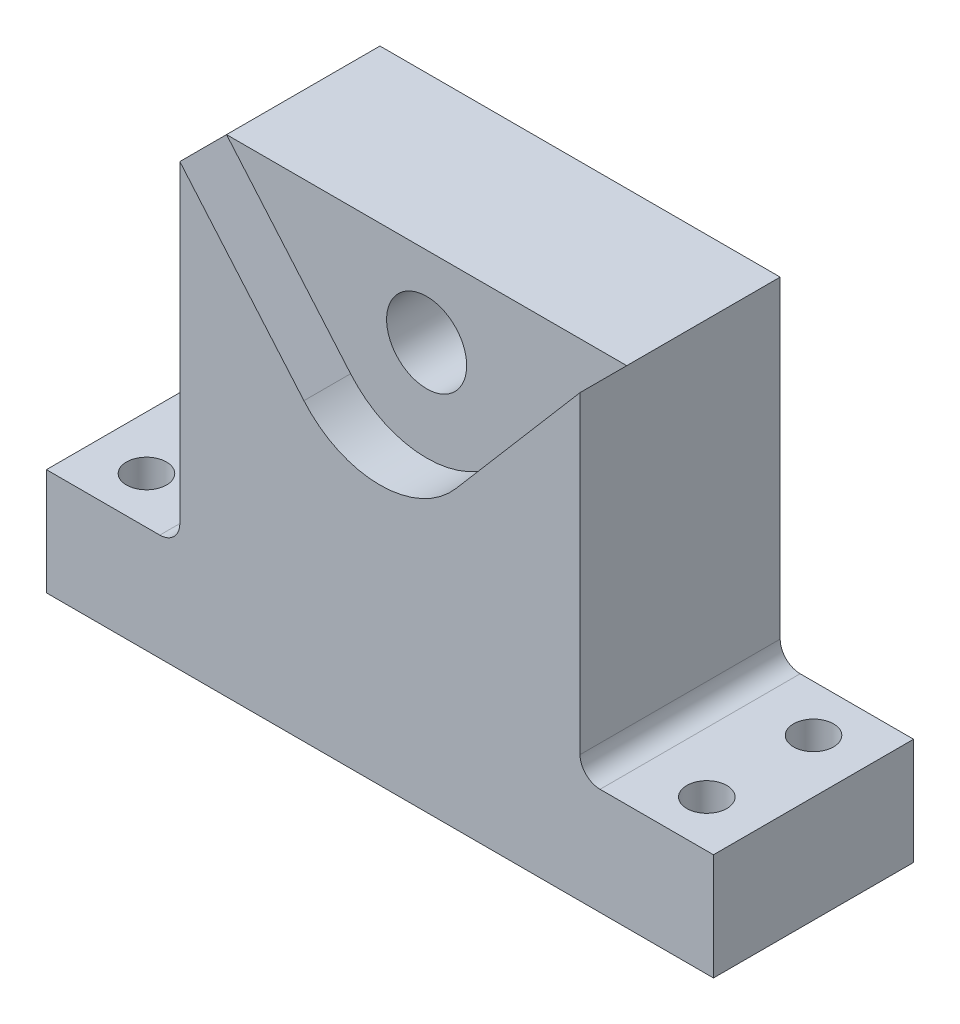
ISO-10303-21;
HEADER;
FILE_DESCRIPTION(('STEP AP214'),'2;1');
FILE_NAME('part.step','',(''),(''),'','','');
FILE_SCHEMA(('AUTOMOTIVE_DESIGN { 1 0 10303 214 1 1 1 1 }'));
ENDSEC;
DATA;
#1=APPLICATION_CONTEXT('core data for automotive mechanical design processes');
#2=APPLICATION_PROTOCOL_DEFINITION('international standard','automotive_design',2000,#1);
#3=PRODUCT_CONTEXT('',#1,'mechanical');
#4=PRODUCT('Part','Part','',(#3));
#5=PRODUCT_RELATED_PRODUCT_CATEGORY('part','',(#4));
#6=PRODUCT_DEFINITION_FORMATION('','',#4);
#7=PRODUCT_DEFINITION_CONTEXT('part definition',#1,'design');
#8=PRODUCT_DEFINITION('design','',#6,#7);
#9=PRODUCT_DEFINITION_SHAPE('','',#8);
#10=(LENGTH_UNIT() NAMED_UNIT(*) SI_UNIT(.MILLI.,.METRE.));
#11=(NAMED_UNIT(*) PLANE_ANGLE_UNIT() SI_UNIT($,.RADIAN.));
#12=(NAMED_UNIT(*) SI_UNIT($,.STERADIAN.) SOLID_ANGLE_UNIT());
#13=UNCERTAINTY_MEASURE_WITH_UNIT(LENGTH_MEASURE(1.E-05),#10,'distance_accuracy_value','');
#14=(GEOMETRIC_REPRESENTATION_CONTEXT(3) GLOBAL_UNCERTAINTY_ASSIGNED_CONTEXT((#13)) GLOBAL_UNIT_ASSIGNED_CONTEXT((#10,
#11,#12)) REPRESENTATION_CONTEXT('',''));
#15=CARTESIAN_POINT('',(0.,0.,0.));
#16=DIRECTION('',(0.,0.,1.));
#17=DIRECTION('',(1.,0.,0.));
#18=AXIS2_PLACEMENT_3D('',#15,#16,#17);
#19=CARTESIAN_POINT('',(-15.,33.,15.));
#20=DIRECTION('',(0.,-1.,0.));
#21=DIRECTION('',(0.,0.,-1.));
#22=AXIS2_PLACEMENT_3D('',#19,#20,#21);
#23=PLANE('',#22);
#24=DIRECTION('',(-1.,0.,0.));
#25=VECTOR('',#24,1.);
#26=CARTESIAN_POINT('',(0.,33.,11.5));
#27=LINE('',#26,#25);
#28=CARTESIAN_POINT('',(15.,33.,11.5));
#29=VERTEX_POINT('',#28);
#30=CARTESIAN_POINT('',(-15.,33.,11.5));
#31=VERTEX_POINT('',#30);
#32=EDGE_CURVE('E143',#29,#31,#27,.T.);
#33=ORIENTED_EDGE('',*,*,#32,.F.);
#34=DIRECTION('',(0.,0.,-1.));
#35=VECTOR('',#34,1.);
#36=CARTESIAN_POINT('',(15.,33.,15.));
#37=LINE('',#36,#35);
#38=CARTESIAN_POINT('',(15.,33.,0.));
#39=VERTEX_POINT('',#38);
#40=EDGE_CURVE('E276',#29,#39,#37,.T.);
#41=ORIENTED_EDGE('',*,*,#40,.T.);
#42=DIRECTION('',(-1.,0.,0.));
#43=VECTOR('',#42,1.);
#44=CARTESIAN_POINT('',(-15.,33.,0.));
#45=LINE('',#44,#43);
#46=CARTESIAN_POINT('',(-15.,33.,0.));
#47=VERTEX_POINT('',#46);
#48=EDGE_CURVE('E258',#39,#47,#45,.T.);
#49=ORIENTED_EDGE('',*,*,#48,.T.);
#50=DIRECTION('',(0.,0.,-1.));
#51=VECTOR('',#50,1.);
#52=CARTESIAN_POINT('',(-15.,33.,15.));
#53=LINE('',#52,#51);
#54=EDGE_CURVE('E271',#31,#47,#53,.T.);
#55=ORIENTED_EDGE('',*,*,#54,.F.);
#56=EDGE_LOOP('',(#33,#41,#49,#55));
#57=FACE_BOUND('',#56,.T.);
#58=ADVANCED_FACE('F38',(#57),#23,.F.);
#59=CARTESIAN_POINT('',(0.,27.,0.));
#60=DIRECTION('',(0.,0.,1.));
#61=DIRECTION('',(1.,0.,0.));
#62=AXIS2_PLACEMENT_3D('',#59,#60,#61);
#63=CYLINDRICAL_SURFACE('',#62,3.);
#64=CARTESIAN_POINT('',(0.,27.,0.));
#65=DIRECTION('',(0.,0.,1.));
#66=DIRECTION('',(1.,0.,0.));
#67=AXIS2_PLACEMENT_3D('',#64,#65,#66);
#68=CIRCLE('',#67,3.);
#69=CARTESIAN_POINT('',(3.,27.,0.));
#70=VERTEX_POINT('',#69);
#71=EDGE_CURVE('E208',#70,#70,#68,.T.);
#72=ORIENTED_EDGE('',*,*,#71,.F.);
#73=EDGE_LOOP('',(#72));
#74=FACE_BOUND('',#73,.T.);
#75=CARTESIAN_POINT('',(0.,27.,11.5));
#76=DIRECTION('',(0.,0.,1.));
#77=DIRECTION('',(1.,0.,0.));
#78=AXIS2_PLACEMENT_3D('',#75,#76,#77);
#79=CIRCLE('',#78,3.);
#80=CARTESIAN_POINT('',(3.,27.,11.5));
#81=VERTEX_POINT('',#80);
#82=EDGE_CURVE('E158',#81,#81,#79,.F.);
#83=ORIENTED_EDGE('',*,*,#82,.F.);
#84=EDGE_LOOP('',(#83));
#85=FACE_BOUND('',#84,.T.);
#86=ADVANCED_FACE('F369',(#74,#85),#63,.F.);
#87=CARTESIAN_POINT('',(-25.,0.,15.));
#88=DIRECTION('',(1.,0.,0.));
#89=DIRECTION('',(0.,0.,-1.));
#90=AXIS2_PLACEMENT_3D('',#87,#88,#89);
#91=PLANE('',#90);
#92=DIRECTION('',(0.,-1.,0.));
#93=VECTOR('',#92,1.);
#94=CARTESIAN_POINT('',(-25.,0.,0.));
#95=LINE('',#94,#93);
#96=CARTESIAN_POINT('',(-25.,7.99999999999999,0.));
#97=VERTEX_POINT('',#96);
#98=CARTESIAN_POINT('',(-25.,0.,0.));
#99=VERTEX_POINT('',#98);
#100=EDGE_CURVE('E215',#97,#99,#95,.T.);
#101=ORIENTED_EDGE('',*,*,#100,.T.);
#102=DIRECTION('',(0.,0.,-1.));
#103=VECTOR('',#102,1.);
#104=CARTESIAN_POINT('',(-25.,0.,15.));
#105=LINE('',#104,#103);
#106=CARTESIAN_POINT('',(-25.,0.,15.));
#107=VERTEX_POINT('',#106);
#108=EDGE_CURVE('E288',#107,#99,#105,.T.);
#109=ORIENTED_EDGE('',*,*,#108,.F.);
#110=DIRECTION('',(0.,-1.,0.));
#111=VECTOR('',#110,1.);
#112=CARTESIAN_POINT('',(-25.,0.,15.));
#113=LINE('',#112,#111);
#114=CARTESIAN_POINT('',(-25.,7.99999999999999,15.));
#115=VERTEX_POINT('',#114);
#116=EDGE_CURVE('E216',#115,#107,#113,.T.);
#117=ORIENTED_EDGE('',*,*,#116,.F.);
#118=DIRECTION('',(0.,0.,-1.));
#119=VECTOR('',#118,1.);
#120=CARTESIAN_POINT('',(-25.,7.99999999999999,15.));
#121=LINE('',#120,#119);
#122=EDGE_CURVE('E241',#115,#97,#121,.T.);
#123=ORIENTED_EDGE('',*,*,#122,.T.);
#124=EDGE_LOOP('',(#101,#109,#117,#123));
#125=FACE_BOUND('',#124,.T.);
#126=ADVANCED_FACE('F350',(#125),#91,.F.);
#127=CARTESIAN_POINT('',(25.,0.,15.));
#128=DIRECTION('',(0.,1.,0.));
#129=DIRECTION('',(0.,0.,1.));
#130=AXIS2_PLACEMENT_3D('',#127,#128,#129);
#131=PLANE('',#130);
#132=CARTESIAN_POINT('',(-21.,0.,3.5));
#133=DIRECTION('',(0.,1.,0.));
#134=DIRECTION('',(1.,0.,0.));
#135=AXIS2_PLACEMENT_3D('',#132,#133,#134);
#136=CIRCLE('',#135,1.5);
#137=CARTESIAN_POINT('',(-19.5,0.,3.5));
#138=VERTEX_POINT('',#137);
#139=EDGE_CURVE('E197',#138,#138,#136,.T.);
#140=ORIENTED_EDGE('',*,*,#139,.T.);
#141=EDGE_LOOP('',(#140));
#142=FACE_BOUND('',#141,.T.);
#143=CARTESIAN_POINT('',(-21.,0.,11.5));
#144=DIRECTION('',(0.,1.,0.));
#145=DIRECTION('',(-1.,0.,0.));
#146=AXIS2_PLACEMENT_3D('',#143,#144,#145);
#147=CIRCLE('',#146,1.5);
#148=CARTESIAN_POINT('',(-22.5,0.,11.5));
#149=VERTEX_POINT('',#148);
#150=EDGE_CURVE('E189',#149,#149,#147,.T.);
#151=ORIENTED_EDGE('',*,*,#150,.T.);
#152=EDGE_LOOP('',(#151));
#153=FACE_BOUND('',#152,.T.);
#154=CARTESIAN_POINT('',(21.,0.,11.5));
#155=DIRECTION('',(0.,1.,0.));
#156=DIRECTION('',(1.,0.,0.));
#157=AXIS2_PLACEMENT_3D('',#154,#155,#156);
#158=CIRCLE('',#157,1.5);
#159=CARTESIAN_POINT('',(22.5,0.,11.5));
#160=VERTEX_POINT('',#159);
#161=EDGE_CURVE('E180',#160,#160,#158,.T.);
#162=ORIENTED_EDGE('',*,*,#161,.T.);
#163=EDGE_LOOP('',(#162));
#164=FACE_BOUND('',#163,.T.);
#165=CARTESIAN_POINT('',(21.,0.,3.5));
#166=DIRECTION('',(0.,1.,0.));
#167=DIRECTION('',(-1.,0.,0.));
#168=AXIS2_PLACEMENT_3D('',#165,#166,#167);
#169=CIRCLE('',#168,1.5);
#170=CARTESIAN_POINT('',(19.5,0.,3.5));
#171=VERTEX_POINT('',#170);
#172=EDGE_CURVE('E204',#171,#171,#169,.T.);
#173=ORIENTED_EDGE('',*,*,#172,.T.);
#174=EDGE_LOOP('',(#173));
#175=FACE_BOUND('',#174,.T.);
#176=DIRECTION('',(1.,0.,0.));
#177=VECTOR('',#176,1.);
#178=CARTESIAN_POINT('',(25.,0.,0.));
#179=LINE('',#178,#177);
#180=CARTESIAN_POINT('',(25.,0.,0.));
#181=VERTEX_POINT('',#180);
#182=EDGE_CURVE('E245',#99,#181,#179,.T.);
#183=ORIENTED_EDGE('',*,*,#182,.T.);
#184=DIRECTION('',(0.,0.,-1.));
#185=VECTOR('',#184,1.);
#186=CARTESIAN_POINT('',(25.,0.,15.));
#187=LINE('',#186,#185);
#188=CARTESIAN_POINT('',(25.,0.,15.));
#189=VERTEX_POINT('',#188);
#190=EDGE_CURVE('E284',#189,#181,#187,.T.);
#191=ORIENTED_EDGE('',*,*,#190,.F.);
#192=DIRECTION('',(1.,0.,0.));
#193=VECTOR('',#192,1.);
#194=CARTESIAN_POINT('',(25.,0.,15.));
#195=LINE('',#194,#193);
#196=EDGE_CURVE('E220',#107,#189,#195,.T.);
#197=ORIENTED_EDGE('',*,*,#196,.F.);
#198=ORIENTED_EDGE('',*,*,#108,.T.);
#199=EDGE_LOOP('',(#183,#191,#197,#198));
#200=FACE_BOUND('',#199,.T.);
#201=ADVANCED_FACE('F355',(#142,#153,#164,#175,#200),#131,.F.);
#202=CARTESIAN_POINT('',(25.,0.,15.));
#203=DIRECTION('',(-1.,0.,0.));
#204=DIRECTION('',(0.,0.,1.));
#205=AXIS2_PLACEMENT_3D('',#202,#203,#204);
#206=PLANE('',#205);
#207=DIRECTION('',(0.,1.,0.));
#208=VECTOR('',#207,1.);
#209=CARTESIAN_POINT('',(25.,0.,0.));
#210=LINE('',#209,#208);
#211=CARTESIAN_POINT('',(25.,7.99999999999999,0.));
#212=VERTEX_POINT('',#211);
#213=EDGE_CURVE('E248',#181,#212,#210,.T.);
#214=ORIENTED_EDGE('',*,*,#213,.T.);
#215=DIRECTION('',(0.,0.,-1.));
#216=VECTOR('',#215,1.);
#217=CARTESIAN_POINT('',(25.,7.99999999999999,15.));
#218=LINE('',#217,#216);
#219=CARTESIAN_POINT('',(25.,7.99999999999999,15.));
#220=VERTEX_POINT('',#219);
#221=EDGE_CURVE('E280',#220,#212,#218,.T.);
#222=ORIENTED_EDGE('',*,*,#221,.F.);
#223=DIRECTION('',(0.,1.,0.));
#224=VECTOR('',#223,1.);
#225=CARTESIAN_POINT('',(25.,0.,15.));
#226=LINE('',#225,#224);
#227=EDGE_CURVE('E224',#189,#220,#226,.T.);
#228=ORIENTED_EDGE('',*,*,#227,.F.);
#229=ORIENTED_EDGE('',*,*,#190,.T.);
#230=EDGE_LOOP('',(#214,#222,#228,#229));
#231=FACE_BOUND('',#230,.T.);
#232=ADVANCED_FACE('F357',(#231),#206,.F.);
#233=CARTESIAN_POINT('',(25.,7.99999999999999,15.));
#234=DIRECTION('',(0.,-1.,0.));
#235=DIRECTION('',(0.,0.,-1.));
#236=AXIS2_PLACEMENT_3D('',#233,#234,#235);
#237=PLANE('',#236);
#238=CARTESIAN_POINT('',(21.,7.99999999999998,11.5));
#239=DIRECTION('',(0.,1.,0.));
#240=DIRECTION('',(1.,0.,0.));
#241=AXIS2_PLACEMENT_3D('',#238,#239,#240);
#242=CIRCLE('',#241,1.5);
#243=CARTESIAN_POINT('',(22.5,7.99999999999998,11.5));
#244=VERTEX_POINT('',#243);
#245=EDGE_CURVE('E185',#244,#244,#242,.T.);
#246=ORIENTED_EDGE('',*,*,#245,.F.);
#247=EDGE_LOOP('',(#246));
#248=FACE_BOUND('',#247,.T.);
#249=CARTESIAN_POINT('',(21.,7.99999999999998,3.5));
#250=DIRECTION('',(0.,1.,0.));
#251=DIRECTION('',(-1.,0.,0.));
#252=AXIS2_PLACEMENT_3D('',#249,#250,#251);
#253=CIRCLE('',#252,1.5);
#254=CARTESIAN_POINT('',(19.5,7.99999999999998,3.5));
#255=VERTEX_POINT('',#254);
#256=EDGE_CURVE('E184',#255,#255,#253,.T.);
#257=ORIENTED_EDGE('',*,*,#256,.F.);
#258=EDGE_LOOP('',(#257));
#259=FACE_BOUND('',#258,.T.);
#260=DIRECTION('',(-1.,0.,0.));
#261=VECTOR('',#260,1.);
#262=CARTESIAN_POINT('',(25.,7.99999999999999,0.));
#263=LINE('',#262,#261);
#264=CARTESIAN_POINT('',(16.5,7.99999999999999,0.));
#265=VERTEX_POINT('',#264);
#266=EDGE_CURVE('E251',#212,#265,#263,.T.);
#267=ORIENTED_EDGE('',*,*,#266,.T.);
#268=DIRECTION('',(0.,0.,-1.));
#269=VECTOR('',#268,1.);
#270=CARTESIAN_POINT('',(16.5,7.99999999999999,15.));
#271=LINE('',#270,#269);
#272=CARTESIAN_POINT('',(16.5,7.99999999999999,15.));
#273=VERTEX_POINT('',#272);
#274=EDGE_CURVE('E62',#265,#273,#271,.F.);
#275=ORIENTED_EDGE('',*,*,#274,.T.);
#276=DIRECTION('',(-1.,0.,0.));
#277=VECTOR('',#276,1.);
#278=CARTESIAN_POINT('',(25.,7.99999999999999,15.));
#279=LINE('',#278,#277);
#280=EDGE_CURVE('E227',#220,#273,#279,.T.);
#281=ORIENTED_EDGE('',*,*,#280,.F.);
#282=ORIENTED_EDGE('',*,*,#221,.T.);
#283=EDGE_LOOP('',(#267,#275,#281,#282));
#284=FACE_BOUND('',#283,.T.);
#285=ADVANCED_FACE('F320',(#248,#259,#284),#237,.F.);
#286=CARTESIAN_POINT('',(15.,7.99999999999999,15.));
#287=DIRECTION('',(-1.,0.,0.));
#288=DIRECTION('',(0.,0.,1.));
#289=AXIS2_PLACEMENT_3D('',#286,#287,#288);
#290=PLANE('',#289);
#291=DIRECTION('',(0.,1.,0.));
#292=VECTOR('',#291,1.);
#293=CARTESIAN_POINT('',(15.,7.99999999999999,15.));
#294=LINE('',#293,#292);
#295=CARTESIAN_POINT('',(15.,9.49999999999999,15.));
#296=VERTEX_POINT('',#295);
#297=CARTESIAN_POINT('',(15.,33.,15.));
#298=VERTEX_POINT('',#297);
#299=EDGE_CURVE('E230',#296,#298,#294,.T.);
#300=ORIENTED_EDGE('',*,*,#299,.F.);
#301=DIRECTION('',(0.,0.,-1.));
#302=VECTOR('',#301,1.);
#303=CARTESIAN_POINT('',(15.,9.49999999999999,0.));
#304=LINE('',#303,#302);
#305=CARTESIAN_POINT('',(15.,9.49999999999999,0.));
#306=VERTEX_POINT('',#305);
#307=EDGE_CURVE('E299',#296,#306,#304,.T.);
#308=ORIENTED_EDGE('',*,*,#307,.T.);
#309=DIRECTION('',(0.,1.,0.));
#310=VECTOR('',#309,1.);
#311=CARTESIAN_POINT('',(15.,7.99999999999999,0.));
#312=LINE('',#311,#310);
#313=EDGE_CURVE('E254',#306,#39,#312,.T.);
#314=ORIENTED_EDGE('',*,*,#313,.T.);
#315=ORIENTED_EDGE('',*,*,#40,.F.);
#316=EDGE_CURVE('E277',#298,#29,#37,.T.);
#317=ORIENTED_EDGE('',*,*,#316,.F.);
#318=EDGE_LOOP('',(#300,#308,#314,#315,#317));
#319=FACE_BOUND('',#318,.T.);
#320=ADVANCED_FACE('F328',(#319),#290,.F.);
#321=CARTESIAN_POINT('',(-15.,7.99999999999999,15.));
#322=DIRECTION('',(1.,0.,0.));
#323=DIRECTION('',(0.,0.,-1.));
#324=AXIS2_PLACEMENT_3D('',#321,#322,#323);
#325=PLANE('',#324);
#326=DIRECTION('',(0.,-1.,0.));
#327=VECTOR('',#326,1.);
#328=CARTESIAN_POINT('',(-15.,7.99999999999999,0.));
#329=LINE('',#328,#327);
#330=CARTESIAN_POINT('',(-15.,9.49999999999999,0.));
#331=VERTEX_POINT('',#330);
#332=EDGE_CURVE('E262',#47,#331,#329,.T.);
#333=ORIENTED_EDGE('',*,*,#332,.T.);
#334=DIRECTION('',(0.,0.,-1.));
#335=VECTOR('',#334,1.);
#336=CARTESIAN_POINT('',(-15.,9.49999999999999,15.));
#337=LINE('',#336,#335);
#338=CARTESIAN_POINT('',(-15.,9.49999999999999,15.));
#339=VERTEX_POINT('',#338);
#340=EDGE_CURVE('E296',#331,#339,#337,.F.);
#341=ORIENTED_EDGE('',*,*,#340,.T.);
#342=DIRECTION('',(0.,-1.,0.));
#343=VECTOR('',#342,1.);
#344=CARTESIAN_POINT('',(-15.,7.99999999999999,15.));
#345=LINE('',#344,#343);
#346=CARTESIAN_POINT('',(-15.,33.,15.));
#347=VERTEX_POINT('',#346);
#348=EDGE_CURVE('E234',#347,#339,#345,.T.);
#349=ORIENTED_EDGE('',*,*,#348,.F.);
#350=EDGE_CURVE('E272',#347,#31,#53,.T.);
#351=ORIENTED_EDGE('',*,*,#350,.T.);
#352=ORIENTED_EDGE('',*,*,#54,.T.);
#353=EDGE_LOOP('',(#333,#341,#349,#351,#352));
#354=FACE_BOUND('',#353,.T.);
#355=ADVANCED_FACE('F337',(#354),#325,.F.);
#356=CARTESIAN_POINT('',(-25.,7.99999999999999,15.));
#357=DIRECTION('',(0.,-1.,0.));
#358=DIRECTION('',(0.,0.,-1.));
#359=AXIS2_PLACEMENT_3D('',#356,#357,#358);
#360=PLANE('',#359);
#361=CARTESIAN_POINT('',(-21.,8.,3.5));
#362=DIRECTION('',(0.,1.,0.));
#363=DIRECTION('',(1.,0.,0.));
#364=AXIS2_PLACEMENT_3D('',#361,#362,#363);
#365=CIRCLE('',#364,1.5);
#366=CARTESIAN_POINT('',(-19.5,8.,3.5));
#367=VERTEX_POINT('',#366);
#368=EDGE_CURVE('E178',#367,#367,#365,.T.);
#369=ORIENTED_EDGE('',*,*,#368,.F.);
#370=EDGE_LOOP('',(#369));
#371=FACE_BOUND('',#370,.T.);
#372=CARTESIAN_POINT('',(-21.,8.,11.5));
#373=DIRECTION('',(0.,1.,0.));
#374=DIRECTION('',(-1.,0.,0.));
#375=AXIS2_PLACEMENT_3D('',#372,#373,#374);
#376=CIRCLE('',#375,1.5);
#377=CARTESIAN_POINT('',(-22.5,8.,11.5));
#378=VERTEX_POINT('',#377);
#379=EDGE_CURVE('E193',#378,#378,#376,.T.);
#380=ORIENTED_EDGE('',*,*,#379,.F.);
#381=EDGE_LOOP('',(#380));
#382=FACE_BOUND('',#381,.T.);
#383=DIRECTION('',(-1.,0.,0.));
#384=VECTOR('',#383,1.);
#385=CARTESIAN_POINT('',(-25.,7.99999999999999,15.));
#386=LINE('',#385,#384);
#387=CARTESIAN_POINT('',(-16.5,7.99999999999999,15.));
#388=VERTEX_POINT('',#387);
#389=EDGE_CURVE('E238',#388,#115,#386,.T.);
#390=ORIENTED_EDGE('',*,*,#389,.F.);
#391=DIRECTION('',(0.,0.,-1.));
#392=VECTOR('',#391,1.);
#393=CARTESIAN_POINT('',(-16.5,7.99999999999999,0.));
#394=LINE('',#393,#392);
#395=CARTESIAN_POINT('',(-16.5,7.99999999999999,0.));
#396=VERTEX_POINT('',#395);
#397=EDGE_CURVE('E292',#388,#396,#394,.T.);
#398=ORIENTED_EDGE('',*,*,#397,.T.);
#399=DIRECTION('',(-1.,0.,0.));
#400=VECTOR('',#399,1.);
#401=CARTESIAN_POINT('',(-25.,7.99999999999999,0.));
#402=LINE('',#401,#400);
#403=EDGE_CURVE('E221',#396,#97,#402,.T.);
#404=ORIENTED_EDGE('',*,*,#403,.T.);
#405=ORIENTED_EDGE('',*,*,#122,.F.);
#406=EDGE_LOOP('',(#390,#398,#404,#405));
#407=FACE_BOUND('',#406,.T.);
#408=ADVANCED_FACE('F346',(#371,#382,#407),#360,.F.);
#409=CARTESIAN_POINT('',(0.,0.,15.));
#410=DIRECTION('',(0.,0.,-1.));
#411=DIRECTION('',(-1.,0.,0.));
#412=AXIS2_PLACEMENT_3D('',#409,#410,#411);
#413=PLANE('',#412);
#414=CARTESIAN_POINT('',(0.,27.,15.));
#415=DIRECTION('',(0.,0.,1.));
#416=DIRECTION('',(1.,0.,0.));
#417=AXIS2_PLACEMENT_3D('',#414,#415,#416);
#418=CIRCLE('',#417,7.5);
#419=CARTESIAN_POINT('',(-5.6998427622852,22.125393094287,15.));
#420=VERTEX_POINT('',#419);
#421=CARTESIAN_POINT('',(5.6998427622852,22.125393094287,15.));
#422=VERTEX_POINT('',#421);
#423=EDGE_CURVE('E171',#420,#422,#418,.T.);
#424=ORIENTED_EDGE('',*,*,#423,.F.);
#425=DIRECTION('',(0.649947587428402,-0.75997903497136,0.));
#426=VECTOR('',#425,1.);
#427=CARTESIAN_POINT('',(7.63671382516141,6.53105348719498,15.));
#428=LINE('',#427,#426);
#429=EDGE_CURVE('E54',#347,#420,#428,.T.);
#430=ORIENTED_EDGE('',*,*,#429,.F.);
#431=ORIENTED_EDGE('',*,*,#348,.T.);
#432=CARTESIAN_POINT('',(-16.5,9.49999999999999,15.));
#433=DIRECTION('',(0.,0.,-1.));
#434=DIRECTION('',(-1.,0.,0.));
#435=AXIS2_PLACEMENT_3D('',#432,#433,#434);
#436=CIRCLE('',#435,1.5);
#437=EDGE_CURVE('E308',#339,#388,#436,.T.);
#438=ORIENTED_EDGE('',*,*,#437,.T.);
#439=ORIENTED_EDGE('',*,*,#389,.T.);
#440=ORIENTED_EDGE('',*,*,#116,.T.);
#441=ORIENTED_EDGE('',*,*,#196,.T.);
#442=ORIENTED_EDGE('',*,*,#227,.T.);
#443=ORIENTED_EDGE('',*,*,#280,.T.);
#444=CARTESIAN_POINT('',(16.5,9.49999999999999,15.));
#445=DIRECTION('',(0.,0.,-1.));
#446=DIRECTION('',(-1.,0.,0.));
#447=AXIS2_PLACEMENT_3D('',#444,#445,#446);
#448=CIRCLE('',#447,1.5);
#449=EDGE_CURVE('E11',#273,#296,#448,.T.);
#450=ORIENTED_EDGE('',*,*,#449,.T.);
#451=ORIENTED_EDGE('',*,*,#299,.T.);
#452=DIRECTION('',(-0.649947587428402,-0.75997903497136,0.));
#453=VECTOR('',#452,1.);
#454=CARTESIAN_POINT('',(-7.63671382516141,6.53105348719498,15.));
#455=LINE('',#454,#453);
#456=EDGE_CURVE('E162',#298,#422,#455,.T.);
#457=ORIENTED_EDGE('',*,*,#456,.T.);
#458=EDGE_LOOP('',(#424,#430,#431,#438,#439,#440,#441,#442,#443,#450,#451,#457));
#459=FACE_BOUND('',#458,.T.);
#460=ADVANCED_FACE('F325',(#459),#413,.F.);
#461=CARTESIAN_POINT('',(0.,0.,0.));
#462=DIRECTION('',(0.,0.,-1.));
#463=DIRECTION('',(-1.,0.,0.));
#464=AXIS2_PLACEMENT_3D('',#461,#462,#463);
#465=PLANE('',#464);
#466=ORIENTED_EDGE('',*,*,#71,.T.);
#467=EDGE_LOOP('',(#466));
#468=FACE_BOUND('',#467,.T.);
#469=ORIENTED_EDGE('',*,*,#100,.F.);
#470=ORIENTED_EDGE('',*,*,#403,.F.);
#471=CARTESIAN_POINT('',(-16.5,9.49999999999999,0.));
#472=DIRECTION('',(0.,0.,-1.));
#473=DIRECTION('',(-1.,0.,0.));
#474=AXIS2_PLACEMENT_3D('',#471,#472,#473);
#475=CIRCLE('',#474,1.5);
#476=EDGE_CURVE('E305',#396,#331,#475,.F.);
#477=ORIENTED_EDGE('',*,*,#476,.T.);
#478=ORIENTED_EDGE('',*,*,#332,.F.);
#479=ORIENTED_EDGE('',*,*,#48,.F.);
#480=ORIENTED_EDGE('',*,*,#313,.F.);
#481=CARTESIAN_POINT('',(16.5,9.49999999999999,0.));
#482=DIRECTION('',(0.,0.,-1.));
#483=DIRECTION('',(-1.,0.,0.));
#484=AXIS2_PLACEMENT_3D('',#481,#482,#483);
#485=CIRCLE('',#484,1.5);
#486=EDGE_CURVE('E47',#306,#265,#485,.F.);
#487=ORIENTED_EDGE('',*,*,#486,.T.);
#488=ORIENTED_EDGE('',*,*,#266,.F.);
#489=ORIENTED_EDGE('',*,*,#213,.F.);
#490=ORIENTED_EDGE('',*,*,#182,.F.);
#491=EDGE_LOOP('',(#469,#470,#477,#478,#479,#480,#487,#488,#489,#490));
#492=FACE_BOUND('',#491,.T.);
#493=ADVANCED_FACE('F315',(#468,#492),#465,.T.);
#494=CARTESIAN_POINT('',(-21.,0.,11.5));
#495=DIRECTION('',(0.,1.,0.));
#496=DIRECTION('',(-1.,0.,0.));
#497=AXIS2_PLACEMENT_3D('',#494,#495,#496);
#498=CYLINDRICAL_SURFACE('',#497,1.5);
#499=ORIENTED_EDGE('',*,*,#150,.F.);
#500=EDGE_LOOP('',(#499));
#501=FACE_BOUND('',#500,.T.);
#502=ORIENTED_EDGE('',*,*,#379,.T.);
#503=EDGE_LOOP('',(#502));
#504=FACE_BOUND('',#503,.T.);
#505=ADVANCED_FACE('F397',(#501,#504),#498,.F.);
#506=CARTESIAN_POINT('',(-21.,0.,3.5));
#507=DIRECTION('',(0.,1.,0.));
#508=DIRECTION('',(-1.,0.,0.));
#509=AXIS2_PLACEMENT_3D('',#506,#507,#508);
#510=CYLINDRICAL_SURFACE('',#509,1.5);
#511=ORIENTED_EDGE('',*,*,#139,.F.);
#512=EDGE_LOOP('',(#511));
#513=FACE_BOUND('',#512,.T.);
#514=ORIENTED_EDGE('',*,*,#368,.T.);
#515=EDGE_LOOP('',(#514));
#516=FACE_BOUND('',#515,.T.);
#517=ADVANCED_FACE('F404',(#513,#516),#510,.F.);
#518=CARTESIAN_POINT('',(21.,0.,3.5));
#519=DIRECTION('',(0.,1.,0.));
#520=DIRECTION('',(-1.,0.,0.));
#521=AXIS2_PLACEMENT_3D('',#518,#519,#520);
#522=CYLINDRICAL_SURFACE('',#521,1.5);
#523=ORIENTED_EDGE('',*,*,#172,.F.);
#524=EDGE_LOOP('',(#523));
#525=FACE_BOUND('',#524,.T.);
#526=ORIENTED_EDGE('',*,*,#256,.T.);
#527=EDGE_LOOP('',(#526));
#528=FACE_BOUND('',#527,.T.);
#529=ADVANCED_FACE('F400',(#525,#528),#522,.F.);
#530=CARTESIAN_POINT('',(21.,0.,11.5));
#531=DIRECTION('',(0.,1.,0.));
#532=DIRECTION('',(-1.,0.,0.));
#533=AXIS2_PLACEMENT_3D('',#530,#531,#532);
#534=CYLINDRICAL_SURFACE('',#533,1.5);
#535=ORIENTED_EDGE('',*,*,#161,.F.);
#536=EDGE_LOOP('',(#535));
#537=FACE_BOUND('',#536,.T.);
#538=ORIENTED_EDGE('',*,*,#245,.T.);
#539=EDGE_LOOP('',(#538));
#540=FACE_BOUND('',#539,.T.);
#541=ADVANCED_FACE('F403',(#537,#540),#534,.F.);
#542=CARTESIAN_POINT('',(-16.5,9.49999999999999,15.));
#543=DIRECTION('',(0.,0.,1.));
#544=DIRECTION('',(1.,0.,0.));
#545=AXIS2_PLACEMENT_3D('',#542,#543,#544);
#546=CYLINDRICAL_SURFACE('',#545,1.5);
#547=ORIENTED_EDGE('',*,*,#437,.F.);
#548=ORIENTED_EDGE('',*,*,#340,.F.);
#549=ORIENTED_EDGE('',*,*,#476,.F.);
#550=ORIENTED_EDGE('',*,*,#397,.F.);
#551=EDGE_LOOP('',(#547,#548,#549,#550));
#552=FACE_BOUND('',#551,.T.);
#553=ADVANCED_FACE('F343',(#552),#546,.F.);
#554=CARTESIAN_POINT('',(16.5,9.49999999999999,15.));
#555=DIRECTION('',(0.,0.,1.));
#556=DIRECTION('',(1.,0.,0.));
#557=AXIS2_PLACEMENT_3D('',#554,#555,#556);
#558=CYLINDRICAL_SURFACE('',#557,1.5);
#559=ORIENTED_EDGE('',*,*,#449,.F.);
#560=ORIENTED_EDGE('',*,*,#274,.F.);
#561=ORIENTED_EDGE('',*,*,#486,.F.);
#562=ORIENTED_EDGE('',*,*,#307,.F.);
#563=EDGE_LOOP('',(#559,#560,#561,#562));
#564=FACE_BOUND('',#563,.T.);
#565=ADVANCED_FACE('F40',(#564),#558,.F.);
#566=CARTESIAN_POINT('',(7.63671382516141,6.53105348719498,11.5));
#567=DIRECTION('',(-0.75997903497136,-0.649947587428402,0.));
#568=DIRECTION('',(0.649947587428402,-0.75997903497136,0.));
#569=AXIS2_PLACEMENT_3D('',#566,#567,#568);
#570=PLANE('',#569);
#571=ORIENTED_EDGE('',*,*,#429,.T.);
#572=DIRECTION('',(0.,0.,1.));
#573=VECTOR('',#572,1.);
#574=CARTESIAN_POINT('',(-5.6998427622852,22.125393094287,11.5));
#575=LINE('',#574,#573);
#576=CARTESIAN_POINT('',(-5.6998427622852,22.125393094287,11.5));
#577=VERTEX_POINT('',#576);
#578=EDGE_CURVE('E132',#577,#420,#575,.T.);
#579=ORIENTED_EDGE('',*,*,#578,.F.);
#580=DIRECTION('',(0.649947587428402,-0.75997903497136,0.));
#581=VECTOR('',#580,1.);
#582=CARTESIAN_POINT('',(7.63671382516141,6.53105348719498,11.5));
#583=LINE('',#582,#581);
#584=EDGE_CURVE('E136',#31,#577,#583,.T.);
#585=ORIENTED_EDGE('',*,*,#584,.F.);
#586=ORIENTED_EDGE('',*,*,#350,.F.);
#587=EDGE_LOOP('',(#571,#579,#585,#586));
#588=FACE_BOUND('',#587,.T.);
#589=ADVANCED_FACE('F134',(#588),#570,.F.);
#590=CARTESIAN_POINT('',(-7.63671382516141,6.53105348719498,11.5));
#591=DIRECTION('',(-0.75997903497136,0.649947587428402,0.));
#592=DIRECTION('',(-0.649947587428402,-0.759979034971361,0.));
#593=AXIS2_PLACEMENT_3D('',#590,#591,#592);
#594=PLANE('',#593);
#595=ORIENTED_EDGE('',*,*,#456,.F.);
#596=ORIENTED_EDGE('',*,*,#316,.T.);
#597=DIRECTION('',(-0.649947587428402,-0.75997903497136,0.));
#598=VECTOR('',#597,1.);
#599=CARTESIAN_POINT('',(-7.63671382516141,6.53105348719498,11.5));
#600=LINE('',#599,#598);
#601=CARTESIAN_POINT('',(5.6998427622852,22.125393094287,11.5));
#602=VERTEX_POINT('',#601);
#603=EDGE_CURVE('E152',#29,#602,#600,.T.);
#604=ORIENTED_EDGE('',*,*,#603,.T.);
#605=DIRECTION('',(0.,0.,1.));
#606=VECTOR('',#605,1.);
#607=CARTESIAN_POINT('',(5.6998427622852,22.125393094287,11.5));
#608=LINE('',#607,#606);
#609=EDGE_CURVE('E142',#602,#422,#608,.T.);
#610=ORIENTED_EDGE('',*,*,#609,.T.);
#611=EDGE_LOOP('',(#595,#596,#604,#610));
#612=FACE_BOUND('',#611,.T.);
#613=ADVANCED_FACE('F331',(#612),#594,.T.);
#614=CARTESIAN_POINT('',(0.,27.,11.5));
#615=DIRECTION('',(0.,0.,1.));
#616=DIRECTION('',(1.,0.,0.));
#617=AXIS2_PLACEMENT_3D('',#614,#615,#616);
#618=CYLINDRICAL_SURFACE('',#617,7.5);
#619=ORIENTED_EDGE('',*,*,#423,.T.);
#620=ORIENTED_EDGE('',*,*,#609,.F.);
#621=CARTESIAN_POINT('',(0.,27.,11.5));
#622=DIRECTION('',(0.,0.,1.));
#623=DIRECTION('',(1.,0.,0.));
#624=AXIS2_PLACEMENT_3D('',#621,#622,#623);
#625=CIRCLE('',#624,7.5);
#626=EDGE_CURVE('E147',#577,#602,#625,.T.);
#627=ORIENTED_EDGE('',*,*,#626,.F.);
#628=ORIENTED_EDGE('',*,*,#578,.T.);
#629=EDGE_LOOP('',(#619,#620,#627,#628));
#630=FACE_BOUND('',#629,.T.);
#631=ADVANCED_FACE('F148',(#630),#618,.F.);
#632=CARTESIAN_POINT('',(0.,0.,11.5));
#633=DIRECTION('',(0.,0.,1.));
#634=DIRECTION('',(1.,0.,0.));
#635=AXIS2_PLACEMENT_3D('',#632,#633,#634);
#636=PLANE('',#635);
#637=ORIENTED_EDGE('',*,*,#82,.T.);
#638=EDGE_LOOP('',(#637));
#639=FACE_BOUND('',#638,.T.);
#640=ORIENTED_EDGE('',*,*,#584,.T.);
#641=ORIENTED_EDGE('',*,*,#626,.T.);
#642=ORIENTED_EDGE('',*,*,#603,.F.);
#643=ORIENTED_EDGE('',*,*,#32,.T.);
#644=EDGE_LOOP('',(#640,#641,#642,#643));
#645=FACE_BOUND('',#644,.T.);
#646=ADVANCED_FACE('F154',(#639,#645),#636,.T.);
#647=CLOSED_SHELL('',(#58,#86,#126,#201,#232,#285,#320,#355,#408,#460,#493,#505,#517,#529,#541,
#553,#565,#589,#613,#631,#646));
#648=MANIFOLD_SOLID_BREP('B2',#647);
#649=ADVANCED_BREP_SHAPE_REPRESENTATION('',(#18,#648),#14);
#650=SHAPE_DEFINITION_REPRESENTATION(#9,#649);
ENDSEC;
END-ISO-10303-21;
